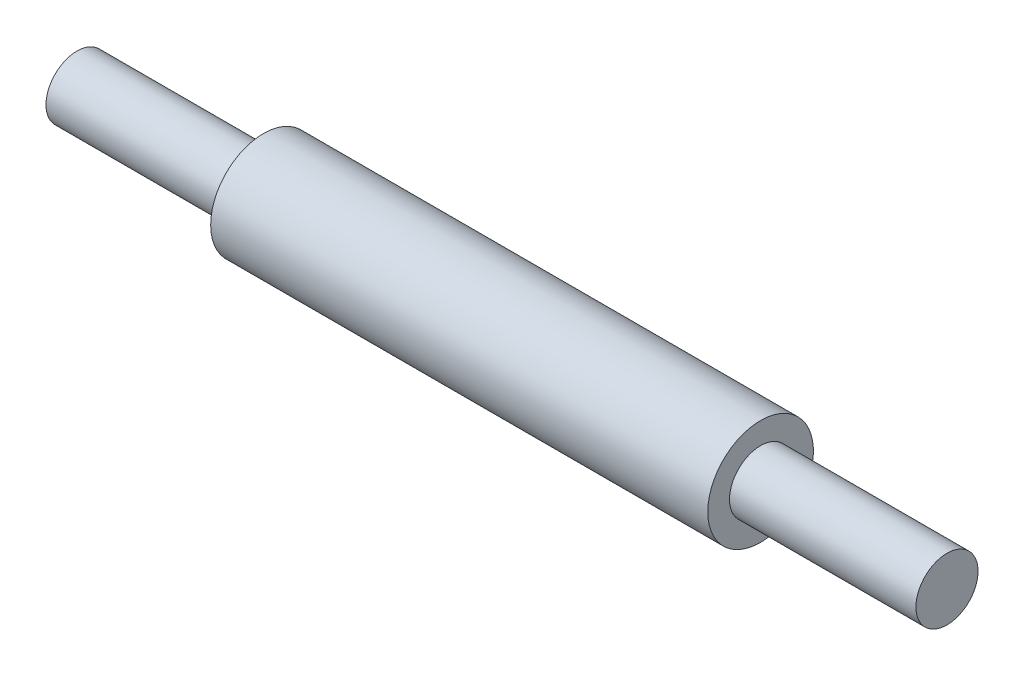
ISO-10303-21;
HEADER;
FILE_DESCRIPTION(('STEP AP214'),'2;1');
FILE_NAME('part.step','',(''),(''),'','','');
FILE_SCHEMA(('AUTOMOTIVE_DESIGN { 1 0 10303 214 1 1 1 1 }'));
ENDSEC;
DATA;
#1=APPLICATION_CONTEXT('core data for automotive mechanical design processes');
#2=APPLICATION_PROTOCOL_DEFINITION('international standard','automotive_design',2000,#1);
#3=PRODUCT_CONTEXT('',#1,'mechanical');
#4=PRODUCT('Part','Part','',(#3));
#5=PRODUCT_RELATED_PRODUCT_CATEGORY('part','',(#4));
#6=PRODUCT_DEFINITION_FORMATION('','',#4);
#7=PRODUCT_DEFINITION_CONTEXT('part definition',#1,'design');
#8=PRODUCT_DEFINITION('design','',#6,#7);
#9=PRODUCT_DEFINITION_SHAPE('','',#8);
#10=(LENGTH_UNIT() NAMED_UNIT(*) SI_UNIT(.MILLI.,.METRE.));
#11=(NAMED_UNIT(*) PLANE_ANGLE_UNIT() SI_UNIT($,.RADIAN.));
#12=(NAMED_UNIT(*) SI_UNIT($,.STERADIAN.) SOLID_ANGLE_UNIT());
#13=UNCERTAINTY_MEASURE_WITH_UNIT(LENGTH_MEASURE(1.E-05),#10,'distance_accuracy_value','');
#14=(GEOMETRIC_REPRESENTATION_CONTEXT(3) GLOBAL_UNCERTAINTY_ASSIGNED_CONTEXT((#13)) GLOBAL_UNIT_ASSIGNED_CONTEXT((#10,
#11,#12)) REPRESENTATION_CONTEXT('',''));
#15=CARTESIAN_POINT('',(0.,0.,0.));
#16=DIRECTION('',(0.,0.,1.));
#17=DIRECTION('',(1.,0.,0.));
#18=AXIS2_PLACEMENT_3D('',#15,#16,#17);
#19=CARTESIAN_POINT('',(70.,0.,-5.00000000000003));
#20=DIRECTION('',(-1.,0.,0.));
#21=DIRECTION('',(0.,0.,1.));
#22=AXIS2_PLACEMENT_3D('',#19,#20,#21);
#23=PLANE('',#22);
#24=CARTESIAN_POINT('',(70.,0.,0.));
#25=DIRECTION('',(-1.,0.,0.));
#26=DIRECTION('',(0.,0.,1.));
#27=AXIS2_PLACEMENT_3D('',#24,#25,#26);
#28=CIRCLE('',#27,5.);
#29=CARTESIAN_POINT('',(70.,0.,4.99999999999997));
#30=VERTEX_POINT('',#29);
#31=EDGE_CURVE('E10',#30,#30,#28,.T.);
#32=ORIENTED_EDGE('',*,*,#31,.F.);
#33=EDGE_LOOP('',(#32));
#34=FACE_BOUND('',#33,.T.);
#35=ADVANCED_FACE('F37',(#34),#23,.F.);
#36=CARTESIAN_POINT('',(-70.,0.,0.));
#37=DIRECTION('',(-1.,0.,0.));
#38=DIRECTION('',(0.,0.,1.));
#39=AXIS2_PLACEMENT_3D('',#36,#37,#38);
#40=CYLINDRICAL_SURFACE('',#39,4.99999999999999);
#41=CARTESIAN_POINT('',(40.,0.,0.));
#42=DIRECTION('',(-1.,0.,0.));
#43=DIRECTION('',(0.,0.,1.));
#44=AXIS2_PLACEMENT_3D('',#41,#42,#43);
#45=CIRCLE('',#44,4.99999999999997);
#46=CARTESIAN_POINT('',(40.,0.,4.99999999999995));
#47=VERTEX_POINT('',#46);
#48=EDGE_CURVE('E44',#47,#47,#45,.T.);
#49=ORIENTED_EDGE('',*,*,#48,.F.);
#50=EDGE_LOOP('',(#49));
#51=FACE_BOUND('',#50,.T.);
#52=ORIENTED_EDGE('',*,*,#31,.T.);
#53=EDGE_LOOP('',(#52));
#54=FACE_BOUND('',#53,.T.);
#55=ADVANCED_FACE('F91',(#51,#54),#40,.T.);
#56=CARTESIAN_POINT('',(40.,0.,-8.49999999999999));
#57=DIRECTION('',(-1.,0.,0.));
#58=DIRECTION('',(0.,0.,1.));
#59=AXIS2_PLACEMENT_3D('',#56,#57,#58);
#60=PLANE('',#59);
#61=CARTESIAN_POINT('',(40.,0.,0.));
#62=DIRECTION('',(-1.,0.,0.));
#63=DIRECTION('',(0.,0.,1.));
#64=AXIS2_PLACEMENT_3D('',#61,#62,#63);
#65=CIRCLE('',#64,8.49999999999997);
#66=CARTESIAN_POINT('',(40.,0.,8.49999999999994));
#67=VERTEX_POINT('',#66);
#68=EDGE_CURVE('E49',#67,#67,#65,.T.);
#69=ORIENTED_EDGE('',*,*,#68,.F.);
#70=EDGE_LOOP('',(#69));
#71=FACE_BOUND('',#70,.T.);
#72=ORIENTED_EDGE('',*,*,#48,.T.);
#73=EDGE_LOOP('',(#72));
#74=FACE_BOUND('',#73,.T.);
#75=ADVANCED_FACE('F86',(#71,#74),#60,.F.);
#76=CARTESIAN_POINT('',(-70.,0.,0.));
#77=DIRECTION('',(-1.,0.,0.));
#78=DIRECTION('',(0.,0.,1.));
#79=AXIS2_PLACEMENT_3D('',#76,#77,#78);
#80=CYLINDRICAL_SURFACE('',#79,8.49999999999997);
#81=CARTESIAN_POINT('',(-40.,0.,0.));
#82=DIRECTION('',(-1.,0.,0.));
#83=DIRECTION('',(0.,0.,1.));
#84=AXIS2_PLACEMENT_3D('',#81,#82,#83);
#85=CIRCLE('',#84,8.49999999999998);
#86=CARTESIAN_POINT('',(-40.,0.,8.49999999999996));
#87=VERTEX_POINT('',#86);
#88=EDGE_CURVE('E54',#87,#87,#85,.T.);
#89=ORIENTED_EDGE('',*,*,#88,.F.);
#90=EDGE_LOOP('',(#89));
#91=FACE_BOUND('',#90,.T.);
#92=ORIENTED_EDGE('',*,*,#68,.T.);
#93=EDGE_LOOP('',(#92));
#94=FACE_BOUND('',#93,.T.);
#95=ADVANCED_FACE('F80',(#91,#94),#80,.T.);
#96=CARTESIAN_POINT('',(-40.,0.,-8.49999999999999));
#97=DIRECTION('',(1.,0.,0.));
#98=DIRECTION('',(0.,0.,-1.));
#99=AXIS2_PLACEMENT_3D('',#96,#97,#98);
#100=PLANE('',#99);
#101=CARTESIAN_POINT('',(-40.,0.,0.));
#102=DIRECTION('',(-1.,0.,0.));
#103=DIRECTION('',(0.,0.,1.));
#104=AXIS2_PLACEMENT_3D('',#101,#102,#103);
#105=CIRCLE('',#104,4.99999999999998);
#106=CARTESIAN_POINT('',(-40.,0.,4.99999999999997));
#107=VERTEX_POINT('',#106);
#108=EDGE_CURVE('E60',#107,#107,#105,.T.);
#109=ORIENTED_EDGE('',*,*,#108,.F.);
#110=EDGE_LOOP('',(#109));
#111=FACE_BOUND('',#110,.T.);
#112=ORIENTED_EDGE('',*,*,#88,.T.);
#113=EDGE_LOOP('',(#112));
#114=FACE_BOUND('',#113,.T.);
#115=ADVANCED_FACE('F74',(#111,#114),#100,.F.);
#116=CARTESIAN_POINT('',(-70.,0.,0.));
#117=DIRECTION('',(-1.,0.,0.));
#118=DIRECTION('',(0.,0.,1.));
#119=AXIS2_PLACEMENT_3D('',#116,#117,#118);
#120=CYLINDRICAL_SURFACE('',#119,4.99999999999999);
#121=CARTESIAN_POINT('',(-70.,0.,0.));
#122=DIRECTION('',(-1.,0.,0.));
#123=DIRECTION('',(0.,0.,1.));
#124=AXIS2_PLACEMENT_3D('',#121,#122,#123);
#125=CIRCLE('',#124,5.);
#126=CARTESIAN_POINT('',(-70.,0.,4.99999999999999));
#127=VERTEX_POINT('',#126);
#128=EDGE_CURVE('E64',#127,#127,#125,.T.);
#129=ORIENTED_EDGE('',*,*,#128,.F.);
#130=EDGE_LOOP('',(#129));
#131=FACE_BOUND('',#130,.T.);
#132=ORIENTED_EDGE('',*,*,#108,.T.);
#133=EDGE_LOOP('',(#132));
#134=FACE_BOUND('',#133,.T.);
#135=ADVANCED_FACE('F71',(#131,#134),#120,.T.);
#136=CARTESIAN_POINT('',(-70.,0.,-5.00000000000001));
#137=DIRECTION('',(1.,0.,0.));
#138=DIRECTION('',(0.,0.,-1.));
#139=AXIS2_PLACEMENT_3D('',#136,#137,#138);
#140=PLANE('',#139);
#141=ORIENTED_EDGE('',*,*,#128,.T.);
#142=EDGE_LOOP('',(#141));
#143=FACE_BOUND('',#142,.T.);
#144=ADVANCED_FACE('F69',(#143),#140,.F.);
#145=CLOSED_SHELL('',(#35,#55,#75,#95,#115,#135,#144));
#146=MANIFOLD_SOLID_BREP('B2',#145);
#147=ADVANCED_BREP_SHAPE_REPRESENTATION('',(#18,#146),#14);
#148=SHAPE_DEFINITION_REPRESENTATION(#9,#147);
ENDSEC;
END-ISO-10303-21;
